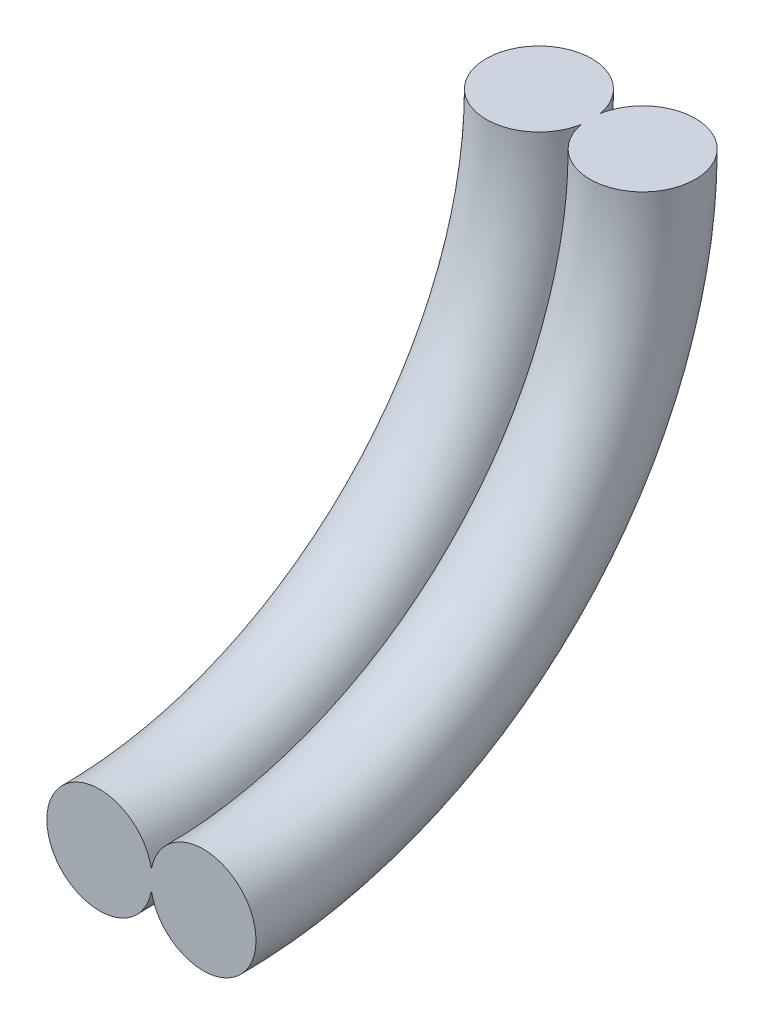
ISO-10303-21;
HEADER;
FILE_DESCRIPTION(('STEP AP214'),'2;1');
FILE_NAME('part.step','',(''),(''),'','','');
FILE_SCHEMA(('AUTOMOTIVE_DESIGN { 1 0 10303 214 1 1 1 1 }'));
ENDSEC;
DATA;
#1=APPLICATION_CONTEXT('core data for automotive mechanical design processes');
#2=APPLICATION_PROTOCOL_DEFINITION('international standard','automotive_design',2000,#1);
#3=PRODUCT_CONTEXT('',#1,'mechanical');
#4=PRODUCT('Part','Part','',(#3));
#5=PRODUCT_RELATED_PRODUCT_CATEGORY('part','',(#4));
#6=PRODUCT_DEFINITION_FORMATION('','',#4);
#7=PRODUCT_DEFINITION_CONTEXT('part definition',#1,'design');
#8=PRODUCT_DEFINITION('design','',#6,#7);
#9=PRODUCT_DEFINITION_SHAPE('','',#8);
#10=(LENGTH_UNIT() NAMED_UNIT(*) SI_UNIT(.MILLI.,.METRE.));
#11=(NAMED_UNIT(*) PLANE_ANGLE_UNIT() SI_UNIT($,.RADIAN.));
#12=(NAMED_UNIT(*) SI_UNIT($,.STERADIAN.) SOLID_ANGLE_UNIT());
#13=UNCERTAINTY_MEASURE_WITH_UNIT(LENGTH_MEASURE(1.E-05),#10,'distance_accuracy_value','');
#14=(GEOMETRIC_REPRESENTATION_CONTEXT(3) GLOBAL_UNCERTAINTY_ASSIGNED_CONTEXT((#13)) GLOBAL_UNIT_ASSIGNED_CONTEXT((#10,
#11,#12)) REPRESENTATION_CONTEXT('',''));
#15=CARTESIAN_POINT('',(0.,0.,0.));
#16=DIRECTION('',(0.,0.,1.));
#17=DIRECTION('',(1.,0.,0.));
#18=AXIS2_PLACEMENT_3D('',#15,#16,#17);
#19=CARTESIAN_POINT('',(0.7493,0.,6.35));
#20=DIRECTION('',(-1.,0.,0.));
#21=DIRECTION('',(0.,0.,1.));
#22=AXIS2_PLACEMENT_3D('',#19,#20,#21);
#23=TOROIDAL_SURFACE('',#22,6.35,0.762);
#24=CARTESIAN_POINT('',(0.,0.,6.35));
#25=DIRECTION('',(1.,0.,0.));
#26=DIRECTION('',(0.,0.,-1.));
#27=AXIS2_PLACEMENT_3D('',#24,#25,#26);
#28=CIRCLE('',#27,6.21145935614414);
#29=CARTESIAN_POINT('',(0.,-6.21145935614413,6.35));
#30=VERTEX_POINT('',#29);
#31=CARTESIAN_POINT('',(0.,0.,0.138540643855868));
#32=VERTEX_POINT('',#31);
#33=EDGE_CURVE('E11',#30,#32,#28,.T.);
#34=ORIENTED_EDGE('',*,*,#33,.F.);
#35=CARTESIAN_POINT('',(0.7493,-6.35,6.35));
#36=DIRECTION('',(0.,0.,-1.));
#37=DIRECTION('',(0.,1.,0.));
#38=AXIS2_PLACEMENT_3D('',#35,#36,#37);
#39=CIRCLE('',#38,0.762);
#40=CARTESIAN_POINT('',(0.,-6.48854064385587,6.35));
#41=VERTEX_POINT('',#40);
#42=EDGE_CURVE('E57',#30,#41,#39,.T.);
#43=ORIENTED_EDGE('',*,*,#42,.T.);
#44=CARTESIAN_POINT('',(0.,0.,6.35));
#45=DIRECTION('',(-1.,0.,0.));
#46=DIRECTION('',(0.,0.,1.));
#47=AXIS2_PLACEMENT_3D('',#44,#45,#46);
#48=CIRCLE('',#47,6.48854064385586);
#49=CARTESIAN_POINT('',(0.,0.,-0.138540643855868));
#50=VERTEX_POINT('',#49);
#51=EDGE_CURVE('E42',#50,#41,#48,.T.);
#52=ORIENTED_EDGE('',*,*,#51,.F.);
#53=CARTESIAN_POINT('',(0.7493,0.,0.));
#54=DIRECTION('',(0.,1.,0.));
#55=DIRECTION('',(0.,0.,1.));
#56=AXIS2_PLACEMENT_3D('',#53,#54,#55);
#57=CIRCLE('',#56,0.762);
#58=EDGE_CURVE('E49',#32,#50,#57,.T.);
#59=ORIENTED_EDGE('',*,*,#58,.F.);
#60=EDGE_LOOP('',(#34,#43,#52,#59));
#61=FACE_BOUND('',#60,.T.);
#62=ADVANCED_FACE('F34',(#61),#23,.T.);
#63=CARTESIAN_POINT('',(0.7493,0.,0.));
#64=DIRECTION('',(0.,1.,0.));
#65=DIRECTION('',(0.,0.,1.));
#66=AXIS2_PLACEMENT_3D('',#63,#64,#65);
#67=PLANE('',#66);
#68=ORIENTED_EDGE('',*,*,#58,.T.);
#69=CARTESIAN_POINT('',(-0.7493,0.,0.));
#70=DIRECTION('',(0.,-1.,0.));
#71=DIRECTION('',(0.,0.,1.));
#72=AXIS2_PLACEMENT_3D('',#69,#70,#71);
#73=CIRCLE('',#72,0.762);
#74=EDGE_CURVE('E67',#50,#32,#73,.F.);
#75=ORIENTED_EDGE('',*,*,#74,.T.);
#76=EDGE_LOOP('',(#68,#75));
#77=FACE_BOUND('',#76,.T.);
#78=ADVANCED_FACE('F36',(#77),#67,.T.);
#79=CARTESIAN_POINT('',(0.7493,-6.35,6.35));
#80=DIRECTION('',(0.,0.,-1.));
#81=DIRECTION('',(0.,1.,0.));
#82=AXIS2_PLACEMENT_3D('',#79,#80,#81);
#83=PLANE('',#82);
#84=ORIENTED_EDGE('',*,*,#42,.F.);
#85=CARTESIAN_POINT('',(-0.7493,-6.35,6.35));
#86=DIRECTION('',(0.,0.,1.));
#87=DIRECTION('',(0.,1.,0.));
#88=AXIS2_PLACEMENT_3D('',#85,#86,#87);
#89=CIRCLE('',#88,0.762);
#90=EDGE_CURVE('E65',#41,#30,#89,.F.);
#91=ORIENTED_EDGE('',*,*,#90,.F.);
#92=EDGE_LOOP('',(#84,#91));
#93=FACE_BOUND('',#92,.T.);
#94=ADVANCED_FACE('F68',(#93),#83,.F.);
#95=CARTESIAN_POINT('',(-0.7493,0.,6.35));
#96=DIRECTION('',(-1.,0.,0.));
#97=DIRECTION('',(0.,0.,1.));
#98=AXIS2_PLACEMENT_3D('',#95,#96,#97);
#99=TOROIDAL_SURFACE('',#98,6.35,0.762);
#100=ORIENTED_EDGE('',*,*,#90,.T.);
#101=ORIENTED_EDGE('',*,*,#33,.T.);
#102=ORIENTED_EDGE('',*,*,#74,.F.);
#103=ORIENTED_EDGE('',*,*,#51,.T.);
#104=EDGE_LOOP('',(#100,#101,#102,#103));
#105=FACE_BOUND('',#104,.T.);
#106=ADVANCED_FACE('F64',(#105),#99,.T.);
#107=CLOSED_SHELL('',(#62,#78,#94,#106));
#108=MANIFOLD_SOLID_BREP('B2',#107);
#109=ADVANCED_BREP_SHAPE_REPRESENTATION('',(#18,#108),#14);
#110=SHAPE_DEFINITION_REPRESENTATION(#9,#109);
ENDSEC;
END-ISO-10303-21;
